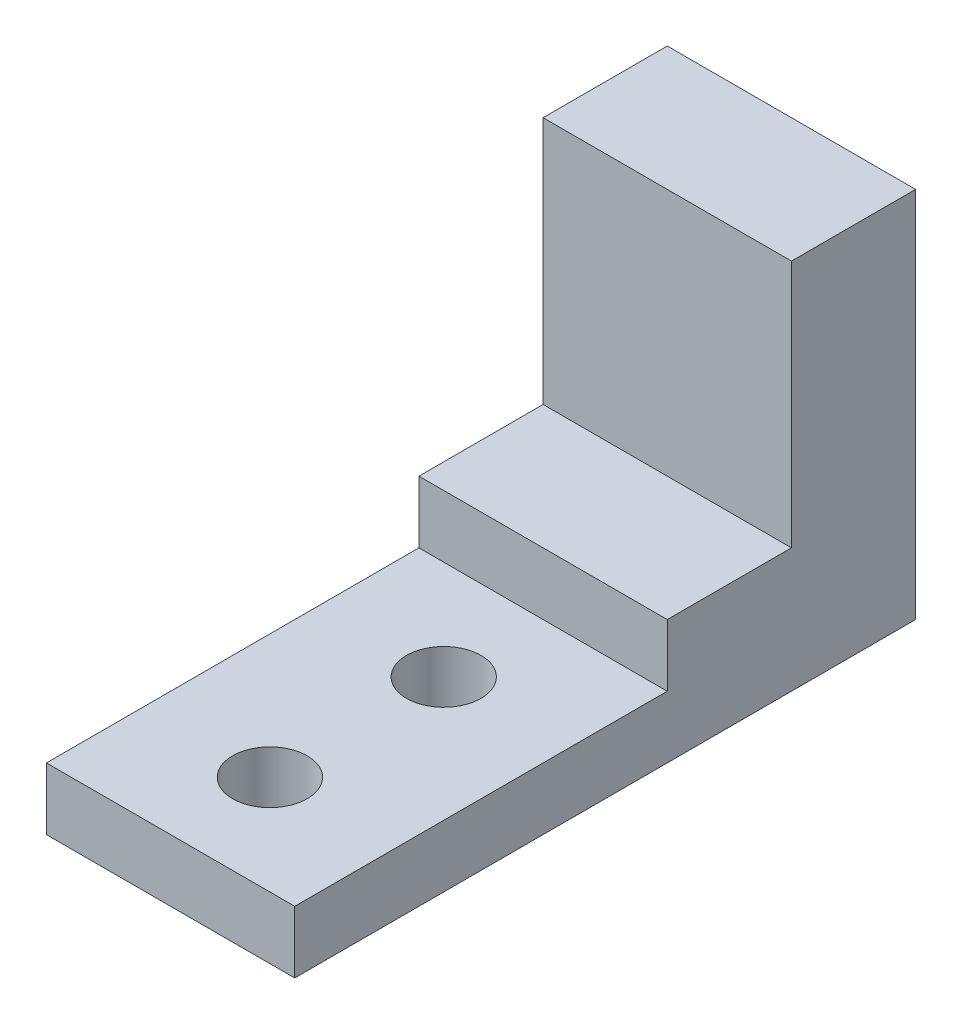
ISO-10303-21;
HEADER;
FILE_DESCRIPTION(('STEP AP214'),'2;1');
FILE_NAME('part.step','',(''),(''),'','','');
FILE_SCHEMA(('AUTOMOTIVE_DESIGN { 1 0 10303 214 1 1 1 1 }'));
ENDSEC;
DATA;
#1=APPLICATION_CONTEXT('core data for automotive mechanical design processes');
#2=APPLICATION_PROTOCOL_DEFINITION('international standard','automotive_design',2000,#1);
#3=PRODUCT_CONTEXT('',#1,'mechanical');
#4=PRODUCT('Part','Part','',(#3));
#5=PRODUCT_RELATED_PRODUCT_CATEGORY('part','',(#4));
#6=PRODUCT_DEFINITION_FORMATION('','',#4);
#7=PRODUCT_DEFINITION_CONTEXT('part definition',#1,'design');
#8=PRODUCT_DEFINITION('design','',#6,#7);
#9=PRODUCT_DEFINITION_SHAPE('','',#8);
#10=(LENGTH_UNIT() NAMED_UNIT(*) SI_UNIT(.MILLI.,.METRE.));
#11=(NAMED_UNIT(*) PLANE_ANGLE_UNIT() SI_UNIT($,.RADIAN.));
#12=(NAMED_UNIT(*) SI_UNIT($,.STERADIAN.) SOLID_ANGLE_UNIT());
#13=UNCERTAINTY_MEASURE_WITH_UNIT(LENGTH_MEASURE(1.E-05),#10,'distance_accuracy_value','');
#14=(GEOMETRIC_REPRESENTATION_CONTEXT(3) GLOBAL_UNCERTAINTY_ASSIGNED_CONTEXT((#13)) GLOBAL_UNIT_ASSIGNED_CONTEXT((#10,
#11,#12)) REPRESENTATION_CONTEXT('',''));
#15=CARTESIAN_POINT('',(0.,0.,0.));
#16=DIRECTION('',(0.,0.,1.));
#17=DIRECTION('',(1.,0.,0.));
#18=AXIS2_PLACEMENT_3D('',#15,#16,#17);
#19=CARTESIAN_POINT('',(10.,2.5,-10.));
#20=DIRECTION('',(0.,-1.,0.));
#21=DIRECTION('',(0.,0.,-1.));
#22=AXIS2_PLACEMENT_3D('',#19,#20,#21);
#23=PLANE('',#22);
#24=DIRECTION('',(1.,0.,0.));
#25=VECTOR('',#24,1.);
#26=CARTESIAN_POINT('',(0.,2.5,-5.));
#27=LINE('',#26,#25);
#28=CARTESIAN_POINT('',(0.,2.5,-5.));
#29=VERTEX_POINT('',#28);
#30=CARTESIAN_POINT('',(10.,2.5,-5.));
#31=VERTEX_POINT('',#30);
#32=EDGE_CURVE('E54',#29,#31,#27,.T.);
#33=ORIENTED_EDGE('',*,*,#32,.F.);
#34=DIRECTION('',(0.,0.,1.));
#35=VECTOR('',#34,1.);
#36=CARTESIAN_POINT('',(0.,2.5,-10.));
#37=LINE('',#36,#35);
#38=CARTESIAN_POINT('',(0.,2.5,0.));
#39=VERTEX_POINT('',#38);
#40=EDGE_CURVE('E136',#29,#39,#37,.T.);
#41=ORIENTED_EDGE('',*,*,#40,.T.);
#42=DIRECTION('',(1.,0.,0.));
#43=VECTOR('',#42,1.);
#44=CARTESIAN_POINT('',(10.,2.5,0.));
#45=LINE('',#44,#43);
#46=CARTESIAN_POINT('',(10.,2.5,0.));
#47=VERTEX_POINT('',#46);
#48=EDGE_CURVE('E144',#39,#47,#45,.T.);
#49=ORIENTED_EDGE('',*,*,#48,.T.);
#50=DIRECTION('',(0.,0.,1.));
#51=VECTOR('',#50,1.);
#52=CARTESIAN_POINT('',(10.,2.5,-10.));
#53=LINE('',#52,#51);
#54=EDGE_CURVE('E140',#31,#47,#53,.T.);
#55=ORIENTED_EDGE('',*,*,#54,.F.);
#56=EDGE_LOOP('',(#33,#41,#49,#55));
#57=FACE_BOUND('',#56,.T.);
#58=ADVANCED_FACE('F39',(#57),#23,.F.);
#59=CARTESIAN_POINT('',(0.,0.,15.));
#60=DIRECTION('',(1.,0.,0.));
#61=DIRECTION('',(0.,0.,-1.));
#62=AXIS2_PLACEMENT_3D('',#59,#60,#61);
#63=PLANE('',#62);
#64=DIRECTION('',(0.,0.,-1.));
#65=VECTOR('',#64,1.);
#66=CARTESIAN_POINT('',(0.,0.,15.));
#67=LINE('',#66,#65);
#68=CARTESIAN_POINT('',(0.,0.,15.));
#69=VERTEX_POINT('',#68);
#70=CARTESIAN_POINT('',(0.,0.,0.));
#71=VERTEX_POINT('',#70);
#72=EDGE_CURVE('E114',#69,#71,#67,.T.);
#73=ORIENTED_EDGE('',*,*,#72,.T.);
#74=DIRECTION('',(0.,1.,0.));
#75=VECTOR('',#74,1.);
#76=CARTESIAN_POINT('',(0.,-2.5,0.));
#77=LINE('',#76,#75);
#78=EDGE_CURVE('E76',#71,#39,#77,.T.);
#79=ORIENTED_EDGE('',*,*,#78,.T.);
#80=ORIENTED_EDGE('',*,*,#40,.F.);
#81=DIRECTION('',(0.,-1.,0.));
#82=VECTOR('',#81,1.);
#83=CARTESIAN_POINT('',(0.,12.5,-5.));
#84=LINE('',#83,#82);
#85=CARTESIAN_POINT('',(0.,12.5,-5.));
#86=VERTEX_POINT('',#85);
#87=EDGE_CURVE('E151',#86,#29,#84,.T.);
#88=ORIENTED_EDGE('',*,*,#87,.F.);
#89=DIRECTION('',(0.,0.,1.));
#90=VECTOR('',#89,1.);
#91=CARTESIAN_POINT('',(0.,12.5,-10.));
#92=LINE('',#91,#90);
#93=CARTESIAN_POINT('',(0.,12.5,-10.));
#94=VERTEX_POINT('',#93);
#95=EDGE_CURVE('E163',#94,#86,#92,.T.);
#96=ORIENTED_EDGE('',*,*,#95,.F.);
#97=DIRECTION('',(0.,1.,0.));
#98=VECTOR('',#97,1.);
#99=CARTESIAN_POINT('',(0.,-2.5,-10.));
#100=LINE('',#99,#98);
#101=CARTESIAN_POINT('',(0.,-2.5,-10.));
#102=VERTEX_POINT('',#101);
#103=EDGE_CURVE('E143',#102,#94,#100,.T.);
#104=ORIENTED_EDGE('',*,*,#103,.F.);
#105=DIRECTION('',(0.,0.,-1.));
#106=VECTOR('',#105,1.);
#107=CARTESIAN_POINT('',(0.,-2.5,15.));
#108=LINE('',#107,#106);
#109=CARTESIAN_POINT('',(0.,-2.5,15.));
#110=VERTEX_POINT('',#109);
#111=EDGE_CURVE('E11',#110,#102,#108,.T.);
#112=ORIENTED_EDGE('',*,*,#111,.F.);
#113=DIRECTION('',(0.,-1.,0.));
#114=VECTOR('',#113,1.);
#115=CARTESIAN_POINT('',(0.,0.,15.));
#116=LINE('',#115,#114);
#117=EDGE_CURVE('E98',#69,#110,#116,.T.);
#118=ORIENTED_EDGE('',*,*,#117,.F.);
#119=EDGE_LOOP('',(#73,#79,#80,#88,#96,#104,#112,#118));
#120=FACE_BOUND('',#119,.T.);
#121=ADVANCED_FACE('F41',(#120),#63,.F.);
#122=CARTESIAN_POINT('',(0.,-2.5,15.));
#123=DIRECTION('',(0.,1.,0.));
#124=DIRECTION('',(0.,0.,1.));
#125=AXIS2_PLACEMENT_3D('',#122,#123,#124);
#126=PLANE('',#125);
#127=CARTESIAN_POINT('',(5.,-2.5,11.));
#128=DIRECTION('',(0.,1.,0.));
#129=DIRECTION('',(0.,0.,1.));
#130=AXIS2_PLACEMENT_3D('',#127,#128,#129);
#131=CIRCLE('',#130,1.5);
#132=CARTESIAN_POINT('',(5.,-2.5,12.5));
#133=VERTEX_POINT('',#132);
#134=EDGE_CURVE('E119',#133,#133,#131,.T.);
#135=ORIENTED_EDGE('',*,*,#134,.T.);
#136=EDGE_LOOP('',(#135));
#137=FACE_BOUND('',#136,.T.);
#138=CARTESIAN_POINT('',(5.,-2.5,4.));
#139=DIRECTION('',(0.,1.,0.));
#140=DIRECTION('',(0.,0.,1.));
#141=AXIS2_PLACEMENT_3D('',#138,#139,#140);
#142=CIRCLE('',#141,1.5);
#143=CARTESIAN_POINT('',(5.,-2.5,5.5));
#144=VERTEX_POINT('',#143);
#145=EDGE_CURVE('E129',#144,#144,#142,.T.);
#146=ORIENTED_EDGE('',*,*,#145,.T.);
#147=EDGE_LOOP('',(#146));
#148=FACE_BOUND('',#147,.T.);
#149=ORIENTED_EDGE('',*,*,#111,.T.);
#150=DIRECTION('',(-1.,0.,0.));
#151=VECTOR('',#150,1.);
#152=CARTESIAN_POINT('',(10.,-2.5,-10.));
#153=LINE('',#152,#151);
#154=CARTESIAN_POINT('',(10.,-2.5,-10.));
#155=VERTEX_POINT('',#154);
#156=EDGE_CURVE('E106',#155,#102,#153,.T.);
#157=ORIENTED_EDGE('',*,*,#156,.F.);
#158=DIRECTION('',(0.,0.,-1.));
#159=VECTOR('',#158,1.);
#160=CARTESIAN_POINT('',(10.,-2.5,15.));
#161=LINE('',#160,#159);
#162=CARTESIAN_POINT('',(10.,-2.5,15.));
#163=VERTEX_POINT('',#162);
#164=EDGE_CURVE('E47',#163,#155,#161,.T.);
#165=ORIENTED_EDGE('',*,*,#164,.F.);
#166=DIRECTION('',(1.,0.,0.));
#167=VECTOR('',#166,1.);
#168=CARTESIAN_POINT('',(0.,-2.5,15.));
#169=LINE('',#168,#167);
#170=EDGE_CURVE('E91',#110,#163,#169,.T.);
#171=ORIENTED_EDGE('',*,*,#170,.F.);
#172=EDGE_LOOP('',(#149,#157,#165,#171));
#173=FACE_BOUND('',#172,.T.);
#174=ADVANCED_FACE('F104',(#137,#148,#173),#126,.F.);
#175=CARTESIAN_POINT('',(10.,0.,15.));
#176=DIRECTION('',(-1.,0.,0.));
#177=DIRECTION('',(0.,0.,1.));
#178=AXIS2_PLACEMENT_3D('',#175,#176,#177);
#179=PLANE('',#178);
#180=ORIENTED_EDGE('',*,*,#164,.T.);
#181=DIRECTION('',(0.,-1.,0.));
#182=VECTOR('',#181,1.);
#183=CARTESIAN_POINT('',(10.,-2.5,-10.));
#184=LINE('',#183,#182);
#185=CARTESIAN_POINT('',(10.,12.5,-10.));
#186=VERTEX_POINT('',#185);
#187=EDGE_CURVE('E147',#186,#155,#184,.T.);
#188=ORIENTED_EDGE('',*,*,#187,.F.);
#189=DIRECTION('',(0.,0.,-1.));
#190=VECTOR('',#189,1.);
#191=CARTESIAN_POINT('',(10.,12.5,-10.));
#192=LINE('',#191,#190);
#193=CARTESIAN_POINT('',(10.,12.5,-5.));
#194=VERTEX_POINT('',#193);
#195=EDGE_CURVE('E166',#194,#186,#192,.T.);
#196=ORIENTED_EDGE('',*,*,#195,.F.);
#197=DIRECTION('',(0.,-1.,0.));
#198=VECTOR('',#197,1.);
#199=CARTESIAN_POINT('',(10.,12.5,-5.));
#200=LINE('',#199,#198);
#201=EDGE_CURVE('E158',#194,#31,#200,.T.);
#202=ORIENTED_EDGE('',*,*,#201,.T.);
#203=ORIENTED_EDGE('',*,*,#54,.T.);
#204=DIRECTION('',(0.,-1.,0.));
#205=VECTOR('',#204,1.);
#206=CARTESIAN_POINT('',(10.,-2.5,0.));
#207=LINE('',#206,#205);
#208=CARTESIAN_POINT('',(10.,0.,0.));
#209=VERTEX_POINT('',#208);
#210=EDGE_CURVE('E149',#47,#209,#207,.T.);
#211=ORIENTED_EDGE('',*,*,#210,.T.);
#212=DIRECTION('',(0.,0.,-1.));
#213=VECTOR('',#212,1.);
#214=CARTESIAN_POINT('',(10.,0.,15.));
#215=LINE('',#214,#213);
#216=CARTESIAN_POINT('',(10.,0.,15.));
#217=VERTEX_POINT('',#216);
#218=EDGE_CURVE('E110',#217,#209,#215,.T.);
#219=ORIENTED_EDGE('',*,*,#218,.F.);
#220=DIRECTION('',(0.,1.,0.));
#221=VECTOR('',#220,1.);
#222=CARTESIAN_POINT('',(10.,0.,15.));
#223=LINE('',#222,#221);
#224=EDGE_CURVE('E95',#163,#217,#223,.T.);
#225=ORIENTED_EDGE('',*,*,#224,.F.);
#226=EDGE_LOOP('',(#180,#188,#196,#202,#203,#211,#219,#225));
#227=FACE_BOUND('',#226,.T.);
#228=ADVANCED_FACE('F111',(#227),#179,.F.);
#229=CARTESIAN_POINT('',(0.,0.,15.));
#230=DIRECTION('',(0.,-1.,0.));
#231=DIRECTION('',(0.,0.,-1.));
#232=AXIS2_PLACEMENT_3D('',#229,#230,#231);
#233=PLANE('',#232);
#234=CARTESIAN_POINT('',(5.,0.,11.));
#235=DIRECTION('',(0.,1.,0.));
#236=DIRECTION('',(0.,0.,1.));
#237=AXIS2_PLACEMENT_3D('',#234,#235,#236);
#238=CIRCLE('',#237,1.5);
#239=CARTESIAN_POINT('',(5.,0.,12.5));
#240=VERTEX_POINT('',#239);
#241=EDGE_CURVE('E132',#240,#240,#238,.T.);
#242=ORIENTED_EDGE('',*,*,#241,.F.);
#243=EDGE_LOOP('',(#242));
#244=FACE_BOUND('',#243,.T.);
#245=CARTESIAN_POINT('',(5.,0.,4.));
#246=DIRECTION('',(0.,1.,0.));
#247=DIRECTION('',(0.,0.,1.));
#248=AXIS2_PLACEMENT_3D('',#245,#246,#247);
#249=CIRCLE('',#248,1.5);
#250=CARTESIAN_POINT('',(5.,0.,5.5));
#251=VERTEX_POINT('',#250);
#252=EDGE_CURVE('E133',#251,#251,#249,.T.);
#253=ORIENTED_EDGE('',*,*,#252,.F.);
#254=EDGE_LOOP('',(#253));
#255=FACE_BOUND('',#254,.T.);
#256=DIRECTION('',(-1.,0.,0.));
#257=VECTOR('',#256,1.);
#258=CARTESIAN_POINT('',(0.,0.,0.));
#259=LINE('',#258,#257);
#260=EDGE_CURVE('E83',#209,#71,#259,.T.);
#261=ORIENTED_EDGE('',*,*,#260,.T.);
#262=ORIENTED_EDGE('',*,*,#72,.F.);
#263=DIRECTION('',(-1.,0.,0.));
#264=VECTOR('',#263,1.);
#265=CARTESIAN_POINT('',(0.,0.,15.));
#266=LINE('',#265,#264);
#267=EDGE_CURVE('E63',#217,#69,#266,.T.);
#268=ORIENTED_EDGE('',*,*,#267,.F.);
#269=ORIENTED_EDGE('',*,*,#218,.T.);
#270=EDGE_LOOP('',(#261,#262,#268,#269));
#271=FACE_BOUND('',#270,.T.);
#272=ADVANCED_FACE('F123',(#244,#255,#271),#233,.F.);
#273=CARTESIAN_POINT('',(0.,0.,15.));
#274=DIRECTION('',(0.,0.,1.));
#275=DIRECTION('',(1.,0.,0.));
#276=AXIS2_PLACEMENT_3D('',#273,#274,#275);
#277=PLANE('',#276);
#278=ORIENTED_EDGE('',*,*,#117,.T.);
#279=ORIENTED_EDGE('',*,*,#170,.T.);
#280=ORIENTED_EDGE('',*,*,#224,.T.);
#281=ORIENTED_EDGE('',*,*,#267,.T.);
#282=EDGE_LOOP('',(#278,#279,#280,#281));
#283=FACE_BOUND('',#282,.T.);
#284=ADVANCED_FACE('F93',(#283),#277,.T.);
#285=CARTESIAN_POINT('',(5.,-15.,4.));
#286=DIRECTION('',(0.,1.,0.));
#287=DIRECTION('',(0.,0.,1.));
#288=AXIS2_PLACEMENT_3D('',#285,#286,#287);
#289=CYLINDRICAL_SURFACE('',#288,1.5);
#290=ORIENTED_EDGE('',*,*,#252,.T.);
#291=EDGE_LOOP('',(#290));
#292=FACE_BOUND('',#291,.T.);
#293=ORIENTED_EDGE('',*,*,#145,.F.);
#294=EDGE_LOOP('',(#293));
#295=FACE_BOUND('',#294,.T.);
#296=ADVANCED_FACE('F208',(#292,#295),#289,.F.);
#297=CARTESIAN_POINT('',(5.,-15.,11.));
#298=DIRECTION('',(0.,1.,0.));
#299=DIRECTION('',(0.,0.,1.));
#300=AXIS2_PLACEMENT_3D('',#297,#298,#299);
#301=CYLINDRICAL_SURFACE('',#300,1.5);
#302=ORIENTED_EDGE('',*,*,#241,.T.);
#303=EDGE_LOOP('',(#302));
#304=FACE_BOUND('',#303,.T.);
#305=ORIENTED_EDGE('',*,*,#134,.F.);
#306=EDGE_LOOP('',(#305));
#307=FACE_BOUND('',#306,.T.);
#308=ADVANCED_FACE('F199',(#304,#307),#301,.F.);
#309=CARTESIAN_POINT('',(0.,0.,0.));
#310=DIRECTION('',(0.,0.,1.));
#311=DIRECTION('',(1.,0.,0.));
#312=AXIS2_PLACEMENT_3D('',#309,#310,#311);
#313=PLANE('',#312);
#314=ORIENTED_EDGE('',*,*,#260,.F.);
#315=ORIENTED_EDGE('',*,*,#210,.F.);
#316=ORIENTED_EDGE('',*,*,#48,.F.);
#317=ORIENTED_EDGE('',*,*,#78,.F.);
#318=EDGE_LOOP('',(#314,#315,#316,#317));
#319=FACE_BOUND('',#318,.T.);
#320=ADVANCED_FACE('F197',(#319),#313,.T.);
#321=CARTESIAN_POINT('',(0.,0.,-10.));
#322=DIRECTION('',(0.,0.,1.));
#323=DIRECTION('',(1.,0.,0.));
#324=AXIS2_PLACEMENT_3D('',#321,#322,#323);
#325=PLANE('',#324);
#326=ORIENTED_EDGE('',*,*,#187,.T.);
#327=ORIENTED_EDGE('',*,*,#156,.T.);
#328=ORIENTED_EDGE('',*,*,#103,.T.);
#329=DIRECTION('',(-1.,0.,0.));
#330=VECTOR('',#329,1.);
#331=CARTESIAN_POINT('',(0.,12.5,-10.));
#332=LINE('',#331,#330);
#333=EDGE_CURVE('E161',#186,#94,#332,.T.);
#334=ORIENTED_EDGE('',*,*,#333,.F.);
#335=EDGE_LOOP('',(#326,#327,#328,#334));
#336=FACE_BOUND('',#335,.T.);
#337=ADVANCED_FACE('F192',(#336),#325,.F.);
#338=CARTESIAN_POINT('',(0.,12.5,-5.));
#339=DIRECTION('',(0.,0.,-1.));
#340=DIRECTION('',(-1.,0.,0.));
#341=AXIS2_PLACEMENT_3D('',#338,#339,#340);
#342=PLANE('',#341);
#343=ORIENTED_EDGE('',*,*,#32,.T.);
#344=ORIENTED_EDGE('',*,*,#201,.F.);
#345=DIRECTION('',(1.,0.,0.));
#346=VECTOR('',#345,1.);
#347=CARTESIAN_POINT('',(0.,12.5,-5.));
#348=LINE('',#347,#346);
#349=EDGE_CURVE('E169',#86,#194,#348,.T.);
#350=ORIENTED_EDGE('',*,*,#349,.F.);
#351=ORIENTED_EDGE('',*,*,#87,.T.);
#352=EDGE_LOOP('',(#343,#344,#350,#351));
#353=FACE_BOUND('',#352,.T.);
#354=ADVANCED_FACE('F186',(#353),#342,.F.);
#355=CARTESIAN_POINT('',(0.,12.5,0.));
#356=DIRECTION('',(0.,1.,0.));
#357=DIRECTION('',(0.,0.,1.));
#358=AXIS2_PLACEMENT_3D('',#355,#356,#357);
#359=PLANE('',#358);
#360=ORIENTED_EDGE('',*,*,#95,.T.);
#361=ORIENTED_EDGE('',*,*,#349,.T.);
#362=ORIENTED_EDGE('',*,*,#195,.T.);
#363=ORIENTED_EDGE('',*,*,#333,.T.);
#364=EDGE_LOOP('',(#360,#361,#362,#363));
#365=FACE_BOUND('',#364,.T.);
#366=ADVANCED_FACE('F177',(#365),#359,.T.);
#367=CLOSED_SHELL('',(#58,#121,#174,#228,#272,#284,#296,#308,#320,#337,#354,#366));
#368=MANIFOLD_SOLID_BREP('B2',#367);
#369=ADVANCED_BREP_SHAPE_REPRESENTATION('',(#18,#368),#14);
#370=SHAPE_DEFINITION_REPRESENTATION(#9,#369);
ENDSEC;
END-ISO-10303-21;
